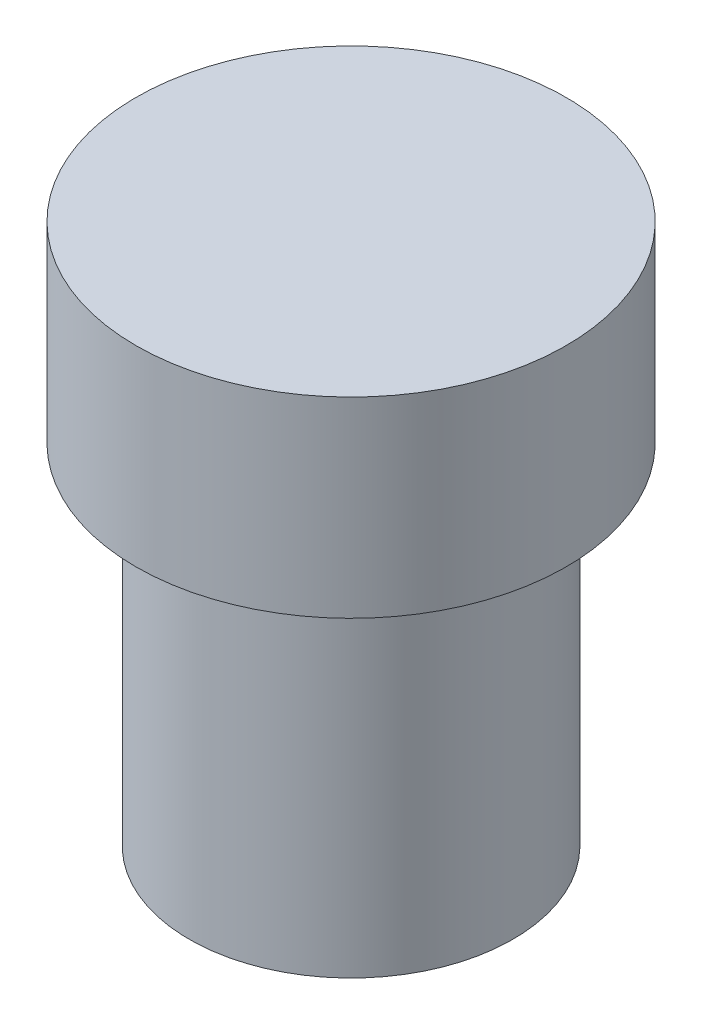
ISO-10303-21;
HEADER;
FILE_DESCRIPTION(('STEP AP214'),'2;1');
FILE_NAME('part.step','',(''),(''),'','','');
FILE_SCHEMA(('AUTOMOTIVE_DESIGN { 1 0 10303 214 1 1 1 1 }'));
ENDSEC;
DATA;
#1=APPLICATION_CONTEXT('core data for automotive mechanical design processes');
#2=APPLICATION_PROTOCOL_DEFINITION('international standard','automotive_design',2000,#1);
#3=PRODUCT_CONTEXT('',#1,'mechanical');
#4=PRODUCT('Part','Part','',(#3));
#5=PRODUCT_RELATED_PRODUCT_CATEGORY('part','',(#4));
#6=PRODUCT_DEFINITION_FORMATION('','',#4);
#7=PRODUCT_DEFINITION_CONTEXT('part definition',#1,'design');
#8=PRODUCT_DEFINITION('design','',#6,#7);
#9=PRODUCT_DEFINITION_SHAPE('','',#8);
#10=(LENGTH_UNIT() NAMED_UNIT(*) SI_UNIT(.MILLI.,.METRE.));
#11=(NAMED_UNIT(*) PLANE_ANGLE_UNIT() SI_UNIT($,.RADIAN.));
#12=(NAMED_UNIT(*) SI_UNIT($,.STERADIAN.) SOLID_ANGLE_UNIT());
#13=UNCERTAINTY_MEASURE_WITH_UNIT(LENGTH_MEASURE(1.E-05),#10,'distance_accuracy_value','');
#14=(GEOMETRIC_REPRESENTATION_CONTEXT(3) GLOBAL_UNCERTAINTY_ASSIGNED_CONTEXT((#13)) GLOBAL_UNIT_ASSIGNED_CONTEXT((#10,
#11,#12)) REPRESENTATION_CONTEXT('',''));
#15=CARTESIAN_POINT('',(0.,0.,0.));
#16=DIRECTION('',(0.,0.,1.));
#17=DIRECTION('',(1.,0.,0.));
#18=AXIS2_PLACEMENT_3D('',#15,#16,#17);
#19=CARTESIAN_POINT('',(0.,4.5,0.));
#20=DIRECTION('',(0.,-1.,0.));
#21=DIRECTION('',(0.,0.,-1.));
#22=AXIS2_PLACEMENT_3D('',#19,#20,#21);
#23=CYLINDRICAL_SURFACE('',#22,5.05);
#24=CARTESIAN_POINT('',(0.,4.5,0.));
#25=DIRECTION('',(0.,1.,0.));
#26=DIRECTION('',(0.,0.,1.));
#27=AXIS2_PLACEMENT_3D('',#24,#25,#26);
#28=CIRCLE('',#27,5.05);
#29=CARTESIAN_POINT('',(0.,4.5,5.05));
#30=VERTEX_POINT('',#29);
#31=EDGE_CURVE('E41',#30,#30,#28,.T.);
#32=ORIENTED_EDGE('',*,*,#31,.F.);
#33=EDGE_LOOP('',(#32));
#34=FACE_BOUND('',#33,.T.);
#35=CARTESIAN_POINT('',(0.,0.,0.));
#36=DIRECTION('',(0.,1.,0.));
#37=DIRECTION('',(0.,0.,1.));
#38=AXIS2_PLACEMENT_3D('',#35,#36,#37);
#39=CIRCLE('',#38,5.05);
#40=CARTESIAN_POINT('',(0.,0.,5.05));
#41=VERTEX_POINT('',#40);
#42=EDGE_CURVE('E37',#41,#41,#39,.T.);
#43=ORIENTED_EDGE('',*,*,#42,.T.);
#44=EDGE_LOOP('',(#43));
#45=FACE_BOUND('',#44,.T.);
#46=ADVANCED_FACE('F34',(#34,#45),#23,.T.);
#47=CARTESIAN_POINT('',(0.,4.5,0.));
#48=DIRECTION('',(0.,1.,0.));
#49=DIRECTION('',(0.,0.,1.));
#50=AXIS2_PLACEMENT_3D('',#47,#48,#49);
#51=PLANE('',#50);
#52=ORIENTED_EDGE('',*,*,#31,.T.);
#53=EDGE_LOOP('',(#52));
#54=FACE_BOUND('',#53,.T.);
#55=ADVANCED_FACE('F58',(#54),#51,.T.);
#56=CARTESIAN_POINT('',(0.,0.,0.));
#57=DIRECTION('',(0.,1.,0.));
#58=DIRECTION('',(0.,0.,1.));
#59=AXIS2_PLACEMENT_3D('',#56,#57,#58);
#60=PLANE('',#59);
#61=CARTESIAN_POINT('',(0.,0.,0.));
#62=DIRECTION('',(0.,-1.,0.));
#63=DIRECTION('',(0.,0.,-1.));
#64=AXIS2_PLACEMENT_3D('',#61,#62,#63);
#65=CIRCLE('',#64,3.8);
#66=CARTESIAN_POINT('',(0.,0.,-3.8));
#67=VERTEX_POINT('',#66);
#68=EDGE_CURVE('E10',#67,#67,#65,.T.);
#69=ORIENTED_EDGE('',*,*,#68,.F.);
#70=EDGE_LOOP('',(#69));
#71=FACE_BOUND('',#70,.T.);
#72=ORIENTED_EDGE('',*,*,#42,.F.);
#73=EDGE_LOOP('',(#72));
#74=FACE_BOUND('',#73,.T.);
#75=ADVANCED_FACE('F55',(#71,#74),#60,.F.);
#76=CARTESIAN_POINT('',(0.,-8.2,0.));
#77=DIRECTION('',(0.,1.,0.));
#78=DIRECTION('',(0.,0.,1.));
#79=AXIS2_PLACEMENT_3D('',#76,#77,#78);
#80=CYLINDRICAL_SURFACE('',#79,3.8);
#81=CARTESIAN_POINT('',(0.,-8.2,0.));
#82=DIRECTION('',(0.,-1.,0.));
#83=DIRECTION('',(0.,0.,-1.));
#84=AXIS2_PLACEMENT_3D('',#81,#82,#83);
#85=CIRCLE('',#84,3.8);
#86=CARTESIAN_POINT('',(0.,-8.2,-3.8));
#87=VERTEX_POINT('',#86);
#88=EDGE_CURVE('E47',#87,#87,#85,.T.);
#89=ORIENTED_EDGE('',*,*,#88,.F.);
#90=EDGE_LOOP('',(#89));
#91=FACE_BOUND('',#90,.T.);
#92=ORIENTED_EDGE('',*,*,#68,.T.);
#93=EDGE_LOOP('',(#92));
#94=FACE_BOUND('',#93,.T.);
#95=ADVANCED_FACE('F57',(#91,#94),#80,.T.);
#96=CARTESIAN_POINT('',(0.,-8.2,0.));
#97=DIRECTION('',(0.,-1.,0.));
#98=DIRECTION('',(0.,0.,-1.));
#99=AXIS2_PLACEMENT_3D('',#96,#97,#98);
#100=PLANE('',#99);
#101=ORIENTED_EDGE('',*,*,#88,.T.);
#102=EDGE_LOOP('',(#101));
#103=FACE_BOUND('',#102,.T.);
#104=ADVANCED_FACE('F64',(#103),#100,.T.);
#105=CLOSED_SHELL('',(#46,#55,#75,#95,#104));
#106=MANIFOLD_SOLID_BREP('B2',#105);
#107=ADVANCED_BREP_SHAPE_REPRESENTATION('',(#18,#106),#14);
#108=SHAPE_DEFINITION_REPRESENTATION(#9,#107);
ENDSEC;
END-ISO-10303-21;
